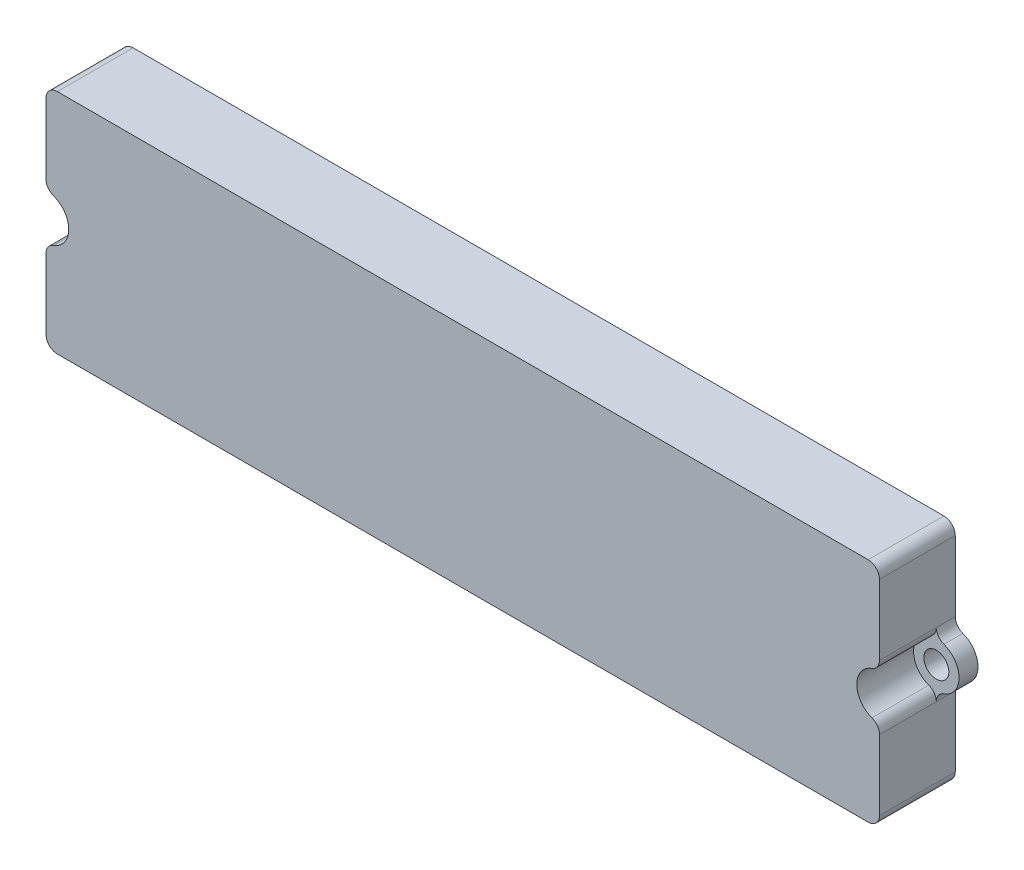
ISO-10303-21;
HEADER;
FILE_DESCRIPTION(('STEP AP214'),'2;1');
FILE_NAME('part.step','',(''),(''),'','','');
FILE_SCHEMA(('AUTOMOTIVE_DESIGN { 1 0 10303 214 1 1 1 1 }'));
ENDSEC;
DATA;
#1=APPLICATION_CONTEXT('core data for automotive mechanical design processes');
#2=APPLICATION_PROTOCOL_DEFINITION('international standard','automotive_design',2000,#1);
#3=PRODUCT_CONTEXT('',#1,'mechanical');
#4=PRODUCT('Part','Part','',(#3));
#5=PRODUCT_RELATED_PRODUCT_CATEGORY('part','',(#4));
#6=PRODUCT_DEFINITION_FORMATION('','',#4);
#7=PRODUCT_DEFINITION_CONTEXT('part definition',#1,'design');
#8=PRODUCT_DEFINITION('design','',#6,#7);
#9=PRODUCT_DEFINITION_SHAPE('','',#8);
#10=(LENGTH_UNIT() NAMED_UNIT(*) SI_UNIT(.MILLI.,.METRE.));
#11=(NAMED_UNIT(*) PLANE_ANGLE_UNIT() SI_UNIT($,.RADIAN.));
#12=(NAMED_UNIT(*) SI_UNIT($,.STERADIAN.) SOLID_ANGLE_UNIT());
#13=UNCERTAINTY_MEASURE_WITH_UNIT(LENGTH_MEASURE(1.E-05),#10,'distance_accuracy_value','');
#14=(GEOMETRIC_REPRESENTATION_CONTEXT(3) GLOBAL_UNCERTAINTY_ASSIGNED_CONTEXT((#13)) GLOBAL_UNIT_ASSIGNED_CONTEXT((#10,
#11,#12)) REPRESENTATION_CONTEXT('',''));
#15=CARTESIAN_POINT('',(0.,0.,0.));
#16=DIRECTION('',(0.,0.,1.));
#17=DIRECTION('',(1.,0.,0.));
#18=AXIS2_PLACEMENT_3D('',#15,#16,#17);
#19=CARTESIAN_POINT('',(110.,0.,-16.9705627484772));
#20=DIRECTION('',(0.,0.,1.));
#21=DIRECTION('',(1.,0.,0.));
#22=AXIS2_PLACEMENT_3D('',#19,#20,#21);
#23=CYLINDRICAL_SURFACE('',#22,6.);
#24=CARTESIAN_POINT('',(110.,0.,5.));
#25=DIRECTION('',(0.,0.,1.));
#26=DIRECTION('',(1.,0.,0.));
#27=AXIS2_PLACEMENT_3D('',#24,#25,#26);
#28=CIRCLE('',#27,6.);
#29=CARTESIAN_POINT('',(112.,-5.65685424949238,5.));
#30=VERTEX_POINT('',#29);
#31=CARTESIAN_POINT('',(112.,5.65685424949238,5.));
#32=VERTEX_POINT('',#31);
#33=EDGE_CURVE('E352',#30,#32,#28,.T.);
#34=ORIENTED_EDGE('',*,*,#33,.F.);
#35=DIRECTION('',(0.,0.,1.));
#36=VECTOR('',#35,1.);
#37=CARTESIAN_POINT('',(112.,-5.65685424949239,-16.9705627484772));
#38=LINE('',#37,#36);
#39=CARTESIAN_POINT('',(112.,-5.65685424949238,0.));
#40=VERTEX_POINT('',#39);
#41=EDGE_CURVE('E300',#30,#40,#38,.F.);
#42=ORIENTED_EDGE('',*,*,#41,.T.);
#43=CARTESIAN_POINT('',(110.,0.,0.));
#44=DIRECTION('',(0.,0.,-1.));
#45=DIRECTION('',(-1.,0.,0.));
#46=AXIS2_PLACEMENT_3D('',#43,#44,#45);
#47=CIRCLE('',#46,6.);
#48=CARTESIAN_POINT('',(112.,5.65685424949238,0.));
#49=VERTEX_POINT('',#48);
#50=EDGE_CURVE('E365',#40,#49,#47,.F.);
#51=ORIENTED_EDGE('',*,*,#50,.T.);
#52=DIRECTION('',(0.,0.,1.));
#53=VECTOR('',#52,1.);
#54=CARTESIAN_POINT('',(112.,5.65685424949238,-16.9705627484772));
#55=LINE('',#54,#53);
#56=EDGE_CURVE('E298',#49,#32,#55,.T.);
#57=ORIENTED_EDGE('',*,*,#56,.T.);
#58=EDGE_LOOP('',(#34,#42,#51,#57));
#59=FACE_BOUND('',#58,.T.);
#60=ADVANCED_FACE('F32',(#59),#23,.T.);
#61=CARTESIAN_POINT('',(110.,0.,0.));
#62=DIRECTION('',(0.,0.,1.));
#63=DIRECTION('',(1.,0.,0.));
#64=AXIS2_PLACEMENT_3D('',#61,#62,#63);
#65=CYLINDRICAL_SURFACE('',#64,3.29999999999999);
#66=CARTESIAN_POINT('',(110.,0.,0.));
#67=DIRECTION('',(0.,0.,1.));
#68=DIRECTION('',(1.,0.,0.));
#69=AXIS2_PLACEMENT_3D('',#66,#67,#68);
#70=CIRCLE('',#69,3.29999999999999);
#71=CARTESIAN_POINT('',(113.3,0.,0.));
#72=VERTEX_POINT('',#71);
#73=EDGE_CURVE('E250',#72,#72,#70,.T.);
#74=ORIENTED_EDGE('',*,*,#73,.F.);
#75=EDGE_LOOP('',(#74));
#76=FACE_BOUND('',#75,.T.);
#77=CARTESIAN_POINT('',(110.,0.,5.));
#78=DIRECTION('',(0.,0.,1.));
#79=DIRECTION('',(1.,0.,0.));
#80=AXIS2_PLACEMENT_3D('',#77,#78,#79);
#81=CIRCLE('',#80,3.29999999999999);
#82=CARTESIAN_POINT('',(113.3,0.,5.));
#83=VERTEX_POINT('',#82);
#84=EDGE_CURVE('E252',#83,#83,#81,.F.);
#85=ORIENTED_EDGE('',*,*,#84,.F.);
#86=EDGE_LOOP('',(#85));
#87=FACE_BOUND('',#86,.T.);
#88=ADVANCED_FACE('F433',(#76,#87),#65,.F.);
#89=CARTESIAN_POINT('',(-110.,0.,-16.9705627484772));
#90=DIRECTION('',(0.,0.,1.));
#91=DIRECTION('',(1.,0.,0.));
#92=AXIS2_PLACEMENT_3D('',#89,#90,#91);
#93=CYLINDRICAL_SURFACE('',#92,6.);
#94=CARTESIAN_POINT('',(-110.,0.,0.));
#95=DIRECTION('',(0.,0.,-1.));
#96=DIRECTION('',(-1.,0.,0.));
#97=AXIS2_PLACEMENT_3D('',#94,#95,#96);
#98=CIRCLE('',#97,6.);
#99=CARTESIAN_POINT('',(-112.,5.65685424949238,0.));
#100=VERTEX_POINT('',#99);
#101=CARTESIAN_POINT('',(-112.,-5.65685424949238,0.));
#102=VERTEX_POINT('',#101);
#103=EDGE_CURVE('E368',#100,#102,#98,.F.);
#104=ORIENTED_EDGE('',*,*,#103,.T.);
#105=DIRECTION('',(0.,0.,1.));
#106=VECTOR('',#105,1.);
#107=CARTESIAN_POINT('',(-112.,-5.65685424949238,-16.9705627484772));
#108=LINE('',#107,#106);
#109=CARTESIAN_POINT('',(-112.,-5.65685424949238,5.));
#110=VERTEX_POINT('',#109);
#111=EDGE_CURVE('E261',#102,#110,#108,.T.);
#112=ORIENTED_EDGE('',*,*,#111,.T.);
#113=CARTESIAN_POINT('',(-110.,0.,5.));
#114=DIRECTION('',(0.,0.,1.));
#115=DIRECTION('',(1.,0.,0.));
#116=AXIS2_PLACEMENT_3D('',#113,#114,#115);
#117=CIRCLE('',#116,6.);
#118=CARTESIAN_POINT('',(-112.,5.65685424949238,5.));
#119=VERTEX_POINT('',#118);
#120=EDGE_CURVE('E251',#119,#110,#117,.T.);
#121=ORIENTED_EDGE('',*,*,#120,.F.);
#122=DIRECTION('',(0.,0.,1.));
#123=VECTOR('',#122,1.);
#124=CARTESIAN_POINT('',(-112.,5.65685424949238,-16.9705627484772));
#125=LINE('',#124,#123);
#126=EDGE_CURVE('E259',#119,#100,#125,.F.);
#127=ORIENTED_EDGE('',*,*,#126,.T.);
#128=EDGE_LOOP('',(#104,#112,#121,#127));
#129=FACE_BOUND('',#128,.T.);
#130=ADVANCED_FACE('F394',(#129),#93,.T.);
#131=CARTESIAN_POINT('',(-110.,0.,0.));
#132=DIRECTION('',(0.,0.,1.));
#133=DIRECTION('',(1.,0.,0.));
#134=AXIS2_PLACEMENT_3D('',#131,#132,#133);
#135=CYLINDRICAL_SURFACE('',#134,3.3);
#136=CARTESIAN_POINT('',(-110.,0.,0.));
#137=DIRECTION('',(0.,0.,1.));
#138=DIRECTION('',(1.,0.,0.));
#139=AXIS2_PLACEMENT_3D('',#136,#137,#138);
#140=CIRCLE('',#139,3.3);
#141=CARTESIAN_POINT('',(-106.7,0.,0.));
#142=VERTEX_POINT('',#141);
#143=EDGE_CURVE('E362',#142,#142,#140,.T.);
#144=ORIENTED_EDGE('',*,*,#143,.F.);
#145=EDGE_LOOP('',(#144));
#146=FACE_BOUND('',#145,.T.);
#147=CARTESIAN_POINT('',(-110.,0.,5.));
#148=DIRECTION('',(0.,0.,1.));
#149=DIRECTION('',(1.,0.,0.));
#150=AXIS2_PLACEMENT_3D('',#147,#148,#149);
#151=CIRCLE('',#150,3.3);
#152=CARTESIAN_POINT('',(-106.7,0.,5.));
#153=VERTEX_POINT('',#152);
#154=EDGE_CURVE('E247',#153,#153,#151,.F.);
#155=ORIENTED_EDGE('',*,*,#154,.F.);
#156=EDGE_LOOP('',(#155));
#157=FACE_BOUND('',#156,.T.);
#158=ADVANCED_FACE('F442',(#146,#157),#135,.F.);
#159=CARTESIAN_POINT('',(110.,-30.,20.));
#160=DIRECTION('',(-1.,0.,0.));
#161=DIRECTION('',(0.,0.,1.));
#162=AXIS2_PLACEMENT_3D('',#159,#160,#161);
#163=PLANE('',#162);
#164=DIRECTION('',(0.,0.,1.));
#165=VECTOR('',#164,1.);
#166=CARTESIAN_POINT('',(110.,-8.48528137423857,20.));
#167=LINE('',#166,#165);
#168=CARTESIAN_POINT('',(110.,-8.48528137423857,0.));
#169=VERTEX_POINT('',#168);
#170=CARTESIAN_POINT('',(110.,-8.48528137423857,5.));
#171=VERTEX_POINT('',#170);
#172=EDGE_CURVE('E295',#169,#171,#167,.T.);
#173=ORIENTED_EDGE('',*,*,#172,.T.);
#174=DIRECTION('',(0.,0.,1.));
#175=VECTOR('',#174,1.);
#176=CARTESIAN_POINT('',(110.,-8.48528137423857,20.));
#177=LINE('',#176,#175);
#178=CARTESIAN_POINT('',(110.,-8.48528137423857,20.));
#179=VERTEX_POINT('',#178);
#180=EDGE_CURVE('E313',#171,#179,#177,.T.);
#181=ORIENTED_EDGE('',*,*,#180,.T.);
#182=DIRECTION('',(0.,1.,0.));
#183=VECTOR('',#182,1.);
#184=CARTESIAN_POINT('',(110.,-30.,20.));
#185=LINE('',#184,#183);
#186=CARTESIAN_POINT('',(110.,-27.,20.));
#187=VERTEX_POINT('',#186);
#188=EDGE_CURVE('E211',#187,#179,#185,.T.);
#189=ORIENTED_EDGE('',*,*,#188,.F.);
#190=DIRECTION('',(0.,0.,-1.));
#191=VECTOR('',#190,1.);
#192=CARTESIAN_POINT('',(110.,-27.,20.));
#193=LINE('',#192,#191);
#194=CARTESIAN_POINT('',(110.,-27.,0.));
#195=VERTEX_POINT('',#194);
#196=EDGE_CURVE('E238',#187,#195,#193,.T.);
#197=ORIENTED_EDGE('',*,*,#196,.T.);
#198=DIRECTION('',(0.,1.,0.));
#199=VECTOR('',#198,1.);
#200=CARTESIAN_POINT('',(110.,-30.,0.));
#201=LINE('',#200,#199);
#202=EDGE_CURVE('E343',#195,#169,#201,.T.);
#203=ORIENTED_EDGE('',*,*,#202,.T.);
#204=EDGE_LOOP('',(#173,#181,#189,#197,#203));
#205=FACE_BOUND('',#204,.T.);
#206=ADVANCED_FACE('F340',(#205),#163,.F.);
#207=CARTESIAN_POINT('',(-110.,-30.,20.));
#208=DIRECTION('',(1.,0.,0.));
#209=DIRECTION('',(0.,1.,0.));
#210=AXIS2_PLACEMENT_3D('',#207,#208,#209);
#211=PLANE('',#210);
#212=DIRECTION('',(0.,0.,1.));
#213=VECTOR('',#212,1.);
#214=CARTESIAN_POINT('',(-110.,8.48528137423857,20.));
#215=LINE('',#214,#213);
#216=CARTESIAN_POINT('',(-110.,8.48528137423857,0.));
#217=VERTEX_POINT('',#216);
#218=CARTESIAN_POINT('',(-110.,8.48528137423857,5.));
#219=VERTEX_POINT('',#218);
#220=EDGE_CURVE('E263',#217,#219,#215,.T.);
#221=ORIENTED_EDGE('',*,*,#220,.T.);
#222=DIRECTION('',(0.,0.,1.));
#223=VECTOR('',#222,1.);
#224=CARTESIAN_POINT('',(-110.,8.48528137423857,20.));
#225=LINE('',#224,#223);
#226=CARTESIAN_POINT('',(-110.,8.48528137423857,20.));
#227=VERTEX_POINT('',#226);
#228=EDGE_CURVE('E275',#219,#227,#225,.T.);
#229=ORIENTED_EDGE('',*,*,#228,.T.);
#230=DIRECTION('',(0.,-1.,0.));
#231=VECTOR('',#230,1.);
#232=CARTESIAN_POINT('',(-110.,-30.,20.));
#233=LINE('',#232,#231);
#234=CARTESIAN_POINT('',(-110.,27.,20.));
#235=VERTEX_POINT('',#234);
#236=EDGE_CURVE('E376',#235,#227,#233,.T.);
#237=ORIENTED_EDGE('',*,*,#236,.F.);
#238=DIRECTION('',(0.,0.,-1.));
#239=VECTOR('',#238,1.);
#240=CARTESIAN_POINT('',(-110.,27.,20.));
#241=LINE('',#240,#239);
#242=CARTESIAN_POINT('',(-110.,27.,0.));
#243=VERTEX_POINT('',#242);
#244=EDGE_CURVE('E191',#235,#243,#241,.T.);
#245=ORIENTED_EDGE('',*,*,#244,.T.);
#246=DIRECTION('',(0.,-1.,0.));
#247=VECTOR('',#246,1.);
#248=CARTESIAN_POINT('',(-110.,-30.,0.));
#249=LINE('',#248,#247);
#250=EDGE_CURVE('E209',#243,#217,#249,.T.);
#251=ORIENTED_EDGE('',*,*,#250,.T.);
#252=EDGE_LOOP('',(#221,#229,#237,#245,#251));
#253=FACE_BOUND('',#252,.T.);
#254=ADVANCED_FACE('F409',(#253),#211,.F.);
#255=CARTESIAN_POINT('',(110.,8.48528137423857,20.));
#256=VERTEX_POINT('',#255);
#257=CARTESIAN_POINT('',(110.,27.,20.));
#258=VERTEX_POINT('',#257);
#259=EDGE_CURVE('E208',#256,#258,#185,.T.);
#260=ORIENTED_EDGE('',*,*,#259,.F.);
#261=DIRECTION('',(0.,0.,1.));
#262=VECTOR('',#261,1.);
#263=CARTESIAN_POINT('',(110.,8.48528137423857,20.));
#264=LINE('',#263,#262);
#265=CARTESIAN_POINT('',(110.,8.48528137423857,5.));
#266=VERTEX_POINT('',#265);
#267=EDGE_CURVE('E323',#256,#266,#264,.F.);
#268=ORIENTED_EDGE('',*,*,#267,.T.);
#269=DIRECTION('',(0.,0.,1.));
#270=VECTOR('',#269,1.);
#271=CARTESIAN_POINT('',(110.,8.48528137423857,20.));
#272=LINE('',#271,#270);
#273=CARTESIAN_POINT('',(110.,8.48528137423857,0.));
#274=VERTEX_POINT('',#273);
#275=EDGE_CURVE('E302',#266,#274,#272,.F.);
#276=ORIENTED_EDGE('',*,*,#275,.T.);
#277=CARTESIAN_POINT('',(110.,27.,0.));
#278=VERTEX_POINT('',#277);
#279=EDGE_CURVE('E370',#274,#278,#201,.T.);
#280=ORIENTED_EDGE('',*,*,#279,.T.);
#281=DIRECTION('',(0.,0.,-1.));
#282=VECTOR('',#281,1.);
#283=CARTESIAN_POINT('',(110.,27.,20.));
#284=LINE('',#283,#282);
#285=EDGE_CURVE('E235',#278,#258,#284,.F.);
#286=ORIENTED_EDGE('',*,*,#285,.T.);
#287=EDGE_LOOP('',(#260,#268,#276,#280,#286));
#288=FACE_BOUND('',#287,.T.);
#289=ADVANCED_FACE('F423',(#288),#163,.F.);
#290=CARTESIAN_POINT('',(-110.,30.,20.));
#291=DIRECTION('',(0.,-1.,0.));
#292=DIRECTION('',(0.,0.,-1.));
#293=AXIS2_PLACEMENT_3D('',#290,#291,#292);
#294=PLANE('',#293);
#295=DIRECTION('',(-1.,0.,0.));
#296=VECTOR('',#295,1.);
#297=CARTESIAN_POINT('',(-110.,30.,20.));
#298=LINE('',#297,#296);
#299=CARTESIAN_POINT('',(107.,30.,20.));
#300=VERTEX_POINT('',#299);
#301=CARTESIAN_POINT('',(-107.,30.,20.));
#302=VERTEX_POINT('',#301);
#303=EDGE_CURVE('E372',#300,#302,#298,.T.);
#304=ORIENTED_EDGE('',*,*,#303,.F.);
#305=DIRECTION('',(0.,0.,-1.));
#306=VECTOR('',#305,1.);
#307=CARTESIAN_POINT('',(107.,30.,20.));
#308=LINE('',#307,#306);
#309=CARTESIAN_POINT('',(107.,30.,0.));
#310=VERTEX_POINT('',#309);
#311=EDGE_CURVE('E243',#300,#310,#308,.T.);
#312=ORIENTED_EDGE('',*,*,#311,.T.);
#313=DIRECTION('',(-1.,0.,0.));
#314=VECTOR('',#313,1.);
#315=CARTESIAN_POINT('',(-110.,30.,0.));
#316=LINE('',#315,#314);
#317=CARTESIAN_POINT('',(-107.,30.,0.));
#318=VERTEX_POINT('',#317);
#319=EDGE_CURVE('E380',#310,#318,#316,.T.);
#320=ORIENTED_EDGE('',*,*,#319,.T.);
#321=DIRECTION('',(0.,0.,-1.));
#322=VECTOR('',#321,1.);
#323=CARTESIAN_POINT('',(-107.,30.,20.));
#324=LINE('',#323,#322);
#325=EDGE_CURVE('E241',#318,#302,#324,.F.);
#326=ORIENTED_EDGE('',*,*,#325,.T.);
#327=EDGE_LOOP('',(#304,#312,#320,#326));
#328=FACE_BOUND('',#327,.T.);
#329=ADVANCED_FACE('F454',(#328),#294,.F.);
#330=CARTESIAN_POINT('',(-110.,-8.48528137423857,20.));
#331=VERTEX_POINT('',#330);
#332=CARTESIAN_POINT('',(-110.,-27.,20.));
#333=VERTEX_POINT('',#332);
#334=EDGE_CURVE('E375',#331,#333,#233,.T.);
#335=ORIENTED_EDGE('',*,*,#334,.F.);
#336=DIRECTION('',(0.,0.,1.));
#337=VECTOR('',#336,1.);
#338=CARTESIAN_POINT('',(-110.,-8.48528137423857,20.));
#339=LINE('',#338,#337);
#340=CARTESIAN_POINT('',(-110.,-8.48528137423857,5.));
#341=VERTEX_POINT('',#340);
#342=EDGE_CURVE('E286',#331,#341,#339,.F.);
#343=ORIENTED_EDGE('',*,*,#342,.T.);
#344=DIRECTION('',(0.,0.,1.));
#345=VECTOR('',#344,1.);
#346=CARTESIAN_POINT('',(-110.,-8.48528137423857,20.));
#347=LINE('',#346,#345);
#348=CARTESIAN_POINT('',(-110.,-8.48528137423857,0.));
#349=VERTEX_POINT('',#348);
#350=EDGE_CURVE('E246',#341,#349,#347,.F.);
#351=ORIENTED_EDGE('',*,*,#350,.T.);
#352=CARTESIAN_POINT('',(-110.,-27.,0.));
#353=VERTEX_POINT('',#352);
#354=EDGE_CURVE('E214',#349,#353,#249,.T.);
#355=ORIENTED_EDGE('',*,*,#354,.T.);
#356=DIRECTION('',(0.,0.,-1.));
#357=VECTOR('',#356,1.);
#358=CARTESIAN_POINT('',(-110.,-27.,20.));
#359=LINE('',#358,#357);
#360=EDGE_CURVE('E187',#353,#333,#359,.F.);
#361=ORIENTED_EDGE('',*,*,#360,.T.);
#362=EDGE_LOOP('',(#335,#343,#351,#355,#361));
#363=FACE_BOUND('',#362,.T.);
#364=ADVANCED_FACE('F387',(#363),#211,.F.);
#365=CARTESIAN_POINT('',(-110.,-30.,20.));
#366=DIRECTION('',(0.,1.,0.));
#367=DIRECTION('',(0.,0.,1.));
#368=AXIS2_PLACEMENT_3D('',#365,#366,#367);
#369=PLANE('',#368);
#370=DIRECTION('',(1.,0.,0.));
#371=VECTOR('',#370,1.);
#372=CARTESIAN_POINT('',(-110.,-30.,20.));
#373=LINE('',#372,#371);
#374=CARTESIAN_POINT('',(-107.,-30.,20.));
#375=VERTEX_POINT('',#374);
#376=CARTESIAN_POINT('',(107.,-30.,20.));
#377=VERTEX_POINT('',#376);
#378=EDGE_CURVE('E201',#375,#377,#373,.T.);
#379=ORIENTED_EDGE('',*,*,#378,.F.);
#380=DIRECTION('',(0.,0.,-1.));
#381=VECTOR('',#380,1.);
#382=CARTESIAN_POINT('',(-107.,-30.,20.));
#383=LINE('',#382,#381);
#384=CARTESIAN_POINT('',(-107.,-30.,0.));
#385=VERTEX_POINT('',#384);
#386=EDGE_CURVE('E185',#375,#385,#383,.T.);
#387=ORIENTED_EDGE('',*,*,#386,.T.);
#388=DIRECTION('',(1.,0.,0.));
#389=VECTOR('',#388,1.);
#390=CARTESIAN_POINT('',(-110.,-30.,0.));
#391=LINE('',#390,#389);
#392=CARTESIAN_POINT('',(107.,-30.,0.));
#393=VERTEX_POINT('',#392);
#394=EDGE_CURVE('E198',#385,#393,#391,.T.);
#395=ORIENTED_EDGE('',*,*,#394,.T.);
#396=DIRECTION('',(0.,0.,-1.));
#397=VECTOR('',#396,1.);
#398=CARTESIAN_POINT('',(107.,-30.,20.));
#399=LINE('',#398,#397);
#400=EDGE_CURVE('E203',#393,#377,#399,.F.);
#401=ORIENTED_EDGE('',*,*,#400,.T.);
#402=EDGE_LOOP('',(#379,#387,#395,#401));
#403=FACE_BOUND('',#402,.T.);
#404=ADVANCED_FACE('F197',(#403),#369,.F.);
#405=CARTESIAN_POINT('',(0.,0.,20.));
#406=DIRECTION('',(0.,0.,-1.));
#407=DIRECTION('',(-1.,0.,0.));
#408=AXIS2_PLACEMENT_3D('',#405,#406,#407);
#409=PLANE('',#408);
#410=ORIENTED_EDGE('',*,*,#188,.T.);
#411=CARTESIAN_POINT('',(107.,-8.48528137423857,20.));
#412=DIRECTION('',(0.,0.,-1.));
#413=DIRECTION('',(-1.,0.,0.));
#414=AXIS2_PLACEMENT_3D('',#411,#412,#413);
#415=CIRCLE('',#414,3.);
#416=CARTESIAN_POINT('',(108.,-5.65685424949238,20.));
#417=VERTEX_POINT('',#416);
#418=EDGE_CURVE('E318',#179,#417,#415,.F.);
#419=ORIENTED_EDGE('',*,*,#418,.T.);
#420=CARTESIAN_POINT('',(110.,0.,20.));
#421=DIRECTION('',(0.,0.,1.));
#422=DIRECTION('',(1.,0.,0.));
#423=AXIS2_PLACEMENT_3D('',#420,#421,#422);
#424=CIRCLE('',#423,6.);
#425=CARTESIAN_POINT('',(108.,5.65685424949238,20.));
#426=VERTEX_POINT('',#425);
#427=EDGE_CURVE('E348',#426,#417,#424,.T.);
#428=ORIENTED_EDGE('',*,*,#427,.F.);
#429=CARTESIAN_POINT('',(107.,8.48528137423857,20.));
#430=DIRECTION('',(0.,0.,-1.));
#431=DIRECTION('',(-1.,0.,0.));
#432=AXIS2_PLACEMENT_3D('',#429,#430,#431);
#433=CIRCLE('',#432,3.);
#434=EDGE_CURVE('E316',#426,#256,#433,.F.);
#435=ORIENTED_EDGE('',*,*,#434,.T.);
#436=ORIENTED_EDGE('',*,*,#259,.T.);
#437=CARTESIAN_POINT('',(107.,27.,20.));
#438=DIRECTION('',(0.,0.,-1.));
#439=DIRECTION('',(-1.,0.,0.));
#440=AXIS2_PLACEMENT_3D('',#437,#438,#439);
#441=CIRCLE('',#440,3.);
#442=EDGE_CURVE('E229',#258,#300,#441,.F.);
#443=ORIENTED_EDGE('',*,*,#442,.T.);
#444=ORIENTED_EDGE('',*,*,#303,.T.);
#445=CARTESIAN_POINT('',(-107.,27.,20.));
#446=DIRECTION('',(0.,0.,-1.));
#447=DIRECTION('',(-1.,0.,0.));
#448=AXIS2_PLACEMENT_3D('',#445,#446,#447);
#449=CIRCLE('',#448,3.);
#450=EDGE_CURVE('E227',#302,#235,#449,.F.);
#451=ORIENTED_EDGE('',*,*,#450,.T.);
#452=ORIENTED_EDGE('',*,*,#236,.T.);
#453=CARTESIAN_POINT('',(-107.,8.48528137423857,20.));
#454=DIRECTION('',(0.,0.,-1.));
#455=DIRECTION('',(-1.,0.,0.));
#456=AXIS2_PLACEMENT_3D('',#453,#454,#455);
#457=CIRCLE('',#456,3.);
#458=CARTESIAN_POINT('',(-108.,5.65685424949238,20.));
#459=VERTEX_POINT('',#458);
#460=EDGE_CURVE('E278',#227,#459,#457,.F.);
#461=ORIENTED_EDGE('',*,*,#460,.T.);
#462=CARTESIAN_POINT('',(-110.,0.,20.));
#463=DIRECTION('',(0.,0.,1.));
#464=DIRECTION('',(1.,0.,0.));
#465=AXIS2_PLACEMENT_3D('',#462,#463,#464);
#466=CIRCLE('',#465,6.);
#467=CARTESIAN_POINT('',(-108.,-5.65685424949238,20.));
#468=VERTEX_POINT('',#467);
#469=EDGE_CURVE('E255',#468,#459,#466,.T.);
#470=ORIENTED_EDGE('',*,*,#469,.F.);
#471=CARTESIAN_POINT('',(-107.,-8.48528137423857,20.));
#472=DIRECTION('',(0.,0.,-1.));
#473=DIRECTION('',(-1.,0.,0.));
#474=AXIS2_PLACEMENT_3D('',#471,#472,#473);
#475=CIRCLE('',#474,3.);
#476=EDGE_CURVE('E291',#468,#331,#475,.F.);
#477=ORIENTED_EDGE('',*,*,#476,.T.);
#478=ORIENTED_EDGE('',*,*,#334,.T.);
#479=CARTESIAN_POINT('',(-107.,-27.,20.));
#480=DIRECTION('',(0.,0.,-1.));
#481=DIRECTION('',(-1.,0.,0.));
#482=AXIS2_PLACEMENT_3D('',#479,#480,#481);
#483=CIRCLE('',#482,3.);
#484=EDGE_CURVE('E233',#333,#375,#483,.F.);
#485=ORIENTED_EDGE('',*,*,#484,.T.);
#486=ORIENTED_EDGE('',*,*,#378,.T.);
#487=CARTESIAN_POINT('',(107.,-27.,20.));
#488=DIRECTION('',(0.,0.,-1.));
#489=DIRECTION('',(-1.,0.,0.));
#490=AXIS2_PLACEMENT_3D('',#487,#488,#489);
#491=CIRCLE('',#490,3.);
#492=EDGE_CURVE('E231',#377,#187,#491,.F.);
#493=ORIENTED_EDGE('',*,*,#492,.T.);
#494=EDGE_LOOP('',(#410,#419,#428,#435,#436,#443,#444,#451,#452,#461,#470,#477,#478,#485,#486,#493));
#495=FACE_BOUND('',#494,.T.);
#496=ADVANCED_FACE('F347',(#495),#409,.F.);
#497=CARTESIAN_POINT('',(0.,0.,0.));
#498=DIRECTION('',(0.,0.,-1.));
#499=DIRECTION('',(-1.,0.,0.));
#500=AXIS2_PLACEMENT_3D('',#497,#498,#499);
#501=PLANE('',#500);
#502=ORIENTED_EDGE('',*,*,#73,.T.);
#503=EDGE_LOOP('',(#502));
#504=FACE_BOUND('',#503,.T.);
#505=ORIENTED_EDGE('',*,*,#143,.T.);
#506=EDGE_LOOP('',(#505));
#507=FACE_BOUND('',#506,.T.);
#508=ORIENTED_EDGE('',*,*,#279,.F.);
#509=CARTESIAN_POINT('',(113.,8.48528137423857,0.));
#510=DIRECTION('',(0.,0.,-1.));
#511=DIRECTION('',(-1.,0.,0.));
#512=AXIS2_PLACEMENT_3D('',#509,#510,#511);
#513=CIRCLE('',#512,3.);
#514=EDGE_CURVE('E309',#274,#49,#513,.F.);
#515=ORIENTED_EDGE('',*,*,#514,.T.);
#516=ORIENTED_EDGE('',*,*,#50,.F.);
#517=CARTESIAN_POINT('',(113.,-8.48528137423857,0.));
#518=DIRECTION('',(0.,0.,-1.));
#519=DIRECTION('',(-1.,0.,0.));
#520=AXIS2_PLACEMENT_3D('',#517,#518,#519);
#521=CIRCLE('',#520,3.);
#522=EDGE_CURVE('E307',#40,#169,#521,.F.);
#523=ORIENTED_EDGE('',*,*,#522,.T.);
#524=ORIENTED_EDGE('',*,*,#202,.F.);
#525=CARTESIAN_POINT('',(107.,-27.,0.));
#526=DIRECTION('',(0.,0.,-1.));
#527=DIRECTION('',(-1.,0.,0.));
#528=AXIS2_PLACEMENT_3D('',#525,#526,#527);
#529=CIRCLE('',#528,3.);
#530=EDGE_CURVE('E192',#195,#393,#529,.T.);
#531=ORIENTED_EDGE('',*,*,#530,.T.);
#532=ORIENTED_EDGE('',*,*,#394,.F.);
#533=CARTESIAN_POINT('',(-107.,-27.,0.));
#534=DIRECTION('',(0.,0.,-1.));
#535=DIRECTION('',(-1.,0.,0.));
#536=AXIS2_PLACEMENT_3D('',#533,#534,#535);
#537=CIRCLE('',#536,3.);
#538=EDGE_CURVE('E181',#385,#353,#537,.T.);
#539=ORIENTED_EDGE('',*,*,#538,.T.);
#540=ORIENTED_EDGE('',*,*,#354,.F.);
#541=CARTESIAN_POINT('',(-113.,-8.48528137423857,0.));
#542=DIRECTION('',(0.,0.,-1.));
#543=DIRECTION('',(-1.,0.,0.));
#544=AXIS2_PLACEMENT_3D('',#541,#542,#543);
#545=CIRCLE('',#544,3.);
#546=EDGE_CURVE('E266',#349,#102,#545,.F.);
#547=ORIENTED_EDGE('',*,*,#546,.T.);
#548=ORIENTED_EDGE('',*,*,#103,.F.);
#549=CARTESIAN_POINT('',(-113.,8.48528137423857,0.));
#550=DIRECTION('',(0.,0.,-1.));
#551=DIRECTION('',(-1.,0.,0.));
#552=AXIS2_PLACEMENT_3D('',#549,#550,#551);
#553=CIRCLE('',#552,3.);
#554=EDGE_CURVE('E273',#100,#217,#553,.F.);
#555=ORIENTED_EDGE('',*,*,#554,.T.);
#556=ORIENTED_EDGE('',*,*,#250,.F.);
#557=CARTESIAN_POINT('',(-107.,27.,0.));
#558=DIRECTION('',(0.,0.,-1.));
#559=DIRECTION('',(-1.,0.,0.));
#560=AXIS2_PLACEMENT_3D('',#557,#558,#559);
#561=CIRCLE('',#560,3.);
#562=EDGE_CURVE('E202',#243,#318,#561,.T.);
#563=ORIENTED_EDGE('',*,*,#562,.T.);
#564=ORIENTED_EDGE('',*,*,#319,.F.);
#565=CARTESIAN_POINT('',(107.,27.,0.));
#566=DIRECTION('',(0.,0.,-1.));
#567=DIRECTION('',(-1.,0.,0.));
#568=AXIS2_PLACEMENT_3D('',#565,#566,#567);
#569=CIRCLE('',#568,3.);
#570=EDGE_CURVE('E220',#310,#278,#569,.T.);
#571=ORIENTED_EDGE('',*,*,#570,.T.);
#572=EDGE_LOOP('',(#508,#515,#516,#523,#524,#531,#532,#539,#540,#547,#548,#555,#556,#563,#564,#571));
#573=FACE_BOUND('',#572,.T.);
#574=ADVANCED_FACE('F206',(#504,#507,#573),#501,.T.);
#575=CARTESIAN_POINT('',(-107.,-27.,20.));
#576=DIRECTION('',(0.,0.,-1.));
#577=DIRECTION('',(-1.,0.,0.));
#578=AXIS2_PLACEMENT_3D('',#575,#576,#577);
#579=CYLINDRICAL_SURFACE('',#578,3.);
#580=ORIENTED_EDGE('',*,*,#484,.F.);
#581=ORIENTED_EDGE('',*,*,#360,.F.);
#582=ORIENTED_EDGE('',*,*,#538,.F.);
#583=ORIENTED_EDGE('',*,*,#386,.F.);
#584=EDGE_LOOP('',(#580,#581,#582,#583));
#585=FACE_BOUND('',#584,.T.);
#586=ADVANCED_FACE('F184',(#585),#579,.T.);
#587=CARTESIAN_POINT('',(107.,-27.,20.));
#588=DIRECTION('',(0.,0.,-1.));
#589=DIRECTION('',(-1.,0.,0.));
#590=AXIS2_PLACEMENT_3D('',#587,#588,#589);
#591=CYLINDRICAL_SURFACE('',#590,3.);
#592=ORIENTED_EDGE('',*,*,#492,.F.);
#593=ORIENTED_EDGE('',*,*,#400,.F.);
#594=ORIENTED_EDGE('',*,*,#530,.F.);
#595=ORIENTED_EDGE('',*,*,#196,.F.);
#596=EDGE_LOOP('',(#592,#593,#594,#595));
#597=FACE_BOUND('',#596,.T.);
#598=ADVANCED_FACE('F461',(#597),#591,.T.);
#599=CARTESIAN_POINT('',(107.,27.,20.));
#600=DIRECTION('',(0.,0.,-1.));
#601=DIRECTION('',(-1.,0.,0.));
#602=AXIS2_PLACEMENT_3D('',#599,#600,#601);
#603=CYLINDRICAL_SURFACE('',#602,3.);
#604=ORIENTED_EDGE('',*,*,#442,.F.);
#605=ORIENTED_EDGE('',*,*,#285,.F.);
#606=ORIENTED_EDGE('',*,*,#570,.F.);
#607=ORIENTED_EDGE('',*,*,#311,.F.);
#608=EDGE_LOOP('',(#604,#605,#606,#607));
#609=FACE_BOUND('',#608,.T.);
#610=ADVANCED_FACE('F420',(#609),#603,.T.);
#611=CARTESIAN_POINT('',(-107.,27.,20.));
#612=DIRECTION('',(0.,0.,-1.));
#613=DIRECTION('',(-1.,0.,0.));
#614=AXIS2_PLACEMENT_3D('',#611,#612,#613);
#615=CYLINDRICAL_SURFACE('',#614,3.);
#616=ORIENTED_EDGE('',*,*,#450,.F.);
#617=ORIENTED_EDGE('',*,*,#325,.F.);
#618=ORIENTED_EDGE('',*,*,#562,.F.);
#619=ORIENTED_EDGE('',*,*,#244,.F.);
#620=EDGE_LOOP('',(#616,#617,#618,#619));
#621=FACE_BOUND('',#620,.T.);
#622=ADVANCED_FACE('F415',(#621),#615,.T.);
#623=CARTESIAN_POINT('',(-110.,0.,5.));
#624=DIRECTION('',(0.,0.,1.));
#625=DIRECTION('',(1.,0.,0.));
#626=AXIS2_PLACEMENT_3D('',#623,#624,#625);
#627=CYLINDRICAL_SURFACE('',#626,6.);
#628=CARTESIAN_POINT('',(-108.,-5.65685424949238,5.));
#629=VERTEX_POINT('',#628);
#630=CARTESIAN_POINT('',(-108.,5.65685424949238,5.));
#631=VERTEX_POINT('',#630);
#632=EDGE_CURVE('E358',#629,#631,#117,.T.);
#633=ORIENTED_EDGE('',*,*,#632,.F.);
#634=DIRECTION('',(0.,0.,1.));
#635=VECTOR('',#634,1.);
#636=CARTESIAN_POINT('',(-108.,-5.65685424949238,5.));
#637=LINE('',#636,#635);
#638=EDGE_CURVE('E289',#629,#468,#637,.T.);
#639=ORIENTED_EDGE('',*,*,#638,.T.);
#640=ORIENTED_EDGE('',*,*,#469,.T.);
#641=DIRECTION('',(0.,0.,1.));
#642=VECTOR('',#641,1.);
#643=CARTESIAN_POINT('',(-108.,5.65685424949238,5.));
#644=LINE('',#643,#642);
#645=EDGE_CURVE('E281',#459,#631,#644,.F.);
#646=ORIENTED_EDGE('',*,*,#645,.T.);
#647=EDGE_LOOP('',(#633,#639,#640,#646));
#648=FACE_BOUND('',#647,.T.);
#649=ADVANCED_FACE('F469',(#648),#627,.F.);
#650=CARTESIAN_POINT('',(-110.,0.,5.));
#651=DIRECTION('',(0.,0.,1.));
#652=DIRECTION('',(1.,0.,0.));
#653=AXIS2_PLACEMENT_3D('',#650,#651,#652);
#654=PLANE('',#653);
#655=CARTESIAN_POINT('',(-113.,-8.48528137423857,5.));
#656=DIRECTION('',(0.,0.,1.));
#657=DIRECTION('',(1.,0.,0.));
#658=AXIS2_PLACEMENT_3D('',#655,#656,#657);
#659=CIRCLE('',#658,3.);
#660=EDGE_CURVE('E268',#110,#341,#659,.F.);
#661=ORIENTED_EDGE('',*,*,#660,.T.);
#662=CARTESIAN_POINT('',(-107.,-8.48528137423857,5.));
#663=DIRECTION('',(0.,0.,1.));
#664=DIRECTION('',(1.,0.,0.));
#665=AXIS2_PLACEMENT_3D('',#662,#663,#664);
#666=CIRCLE('',#665,3.);
#667=EDGE_CURVE('E293',#341,#629,#666,.F.);
#668=ORIENTED_EDGE('',*,*,#667,.T.);
#669=ORIENTED_EDGE('',*,*,#632,.T.);
#670=CARTESIAN_POINT('',(-107.,8.48528137423857,5.));
#671=DIRECTION('',(0.,0.,1.));
#672=DIRECTION('',(1.,0.,0.));
#673=AXIS2_PLACEMENT_3D('',#670,#671,#672);
#674=CIRCLE('',#673,3.);
#675=EDGE_CURVE('E284',#631,#219,#674,.F.);
#676=ORIENTED_EDGE('',*,*,#675,.T.);
#677=CARTESIAN_POINT('',(-113.,8.48528137423857,5.));
#678=DIRECTION('',(0.,0.,1.));
#679=DIRECTION('',(1.,0.,0.));
#680=AXIS2_PLACEMENT_3D('',#677,#678,#679);
#681=CIRCLE('',#680,3.);
#682=EDGE_CURVE('E271',#219,#119,#681,.F.);
#683=ORIENTED_EDGE('',*,*,#682,.T.);
#684=ORIENTED_EDGE('',*,*,#120,.T.);
#685=EDGE_LOOP('',(#661,#668,#669,#676,#683,#684));
#686=FACE_BOUND('',#685,.T.);
#687=ORIENTED_EDGE('',*,*,#154,.T.);
#688=EDGE_LOOP('',(#687));
#689=FACE_BOUND('',#688,.T.);
#690=ADVANCED_FACE('F400',(#686,#689),#654,.T.);
#691=CARTESIAN_POINT('',(110.,0.,5.));
#692=DIRECTION('',(0.,0.,1.));
#693=DIRECTION('',(1.,0.,0.));
#694=AXIS2_PLACEMENT_3D('',#691,#692,#693);
#695=CYLINDRICAL_SURFACE('',#694,6.);
#696=ORIENTED_EDGE('',*,*,#427,.T.);
#697=DIRECTION('',(0.,0.,1.));
#698=VECTOR('',#697,1.);
#699=CARTESIAN_POINT('',(108.,-5.65685424949239,5.));
#700=LINE('',#699,#698);
#701=CARTESIAN_POINT('',(108.,-5.65685424949238,5.));
#702=VERTEX_POINT('',#701);
#703=EDGE_CURVE('E47',#417,#702,#700,.F.);
#704=ORIENTED_EDGE('',*,*,#703,.T.);
#705=CARTESIAN_POINT('',(108.,5.65685424949238,5.));
#706=VERTEX_POINT('',#705);
#707=EDGE_CURVE('E256',#706,#702,#28,.T.);
#708=ORIENTED_EDGE('',*,*,#707,.F.);
#709=DIRECTION('',(0.,0.,1.));
#710=VECTOR('',#709,1.);
#711=CARTESIAN_POINT('',(108.,5.65685424949238,5.));
#712=LINE('',#711,#710);
#713=EDGE_CURVE('E320',#706,#426,#712,.T.);
#714=ORIENTED_EDGE('',*,*,#713,.T.);
#715=EDGE_LOOP('',(#696,#704,#708,#714));
#716=FACE_BOUND('',#715,.T.);
#717=ADVANCED_FACE('F350',(#716),#695,.F.);
#718=CARTESIAN_POINT('',(110.,0.,5.));
#719=DIRECTION('',(0.,0.,1.));
#720=DIRECTION('',(1.,0.,0.));
#721=AXIS2_PLACEMENT_3D('',#718,#719,#720);
#722=PLANE('',#721);
#723=CARTESIAN_POINT('',(113.,8.48528137423857,5.));
#724=DIRECTION('',(0.,0.,1.));
#725=DIRECTION('',(1.,0.,0.));
#726=AXIS2_PLACEMENT_3D('',#723,#724,#725);
#727=CIRCLE('',#726,3.);
#728=EDGE_CURVE('E311',#32,#266,#727,.F.);
#729=ORIENTED_EDGE('',*,*,#728,.T.);
#730=CARTESIAN_POINT('',(107.,8.48528137423857,5.));
#731=DIRECTION('',(0.,0.,1.));
#732=DIRECTION('',(1.,0.,0.));
#733=AXIS2_PLACEMENT_3D('',#730,#731,#732);
#734=CIRCLE('',#733,3.);
#735=EDGE_CURVE('E11',#266,#706,#734,.F.);
#736=ORIENTED_EDGE('',*,*,#735,.T.);
#737=ORIENTED_EDGE('',*,*,#707,.T.);
#738=CARTESIAN_POINT('',(107.,-8.48528137423857,5.));
#739=DIRECTION('',(0.,0.,1.));
#740=DIRECTION('',(1.,0.,0.));
#741=AXIS2_PLACEMENT_3D('',#738,#739,#740);
#742=CIRCLE('',#741,3.);
#743=EDGE_CURVE('E40',#702,#171,#742,.F.);
#744=ORIENTED_EDGE('',*,*,#743,.T.);
#745=CARTESIAN_POINT('',(113.,-8.48528137423857,5.));
#746=DIRECTION('',(0.,0.,1.));
#747=DIRECTION('',(1.,0.,0.));
#748=AXIS2_PLACEMENT_3D('',#745,#746,#747);
#749=CIRCLE('',#748,3.);
#750=EDGE_CURVE('E305',#171,#30,#749,.F.);
#751=ORIENTED_EDGE('',*,*,#750,.T.);
#752=ORIENTED_EDGE('',*,*,#33,.T.);
#753=EDGE_LOOP('',(#729,#736,#737,#744,#751,#752));
#754=FACE_BOUND('',#753,.T.);
#755=ORIENTED_EDGE('',*,*,#84,.T.);
#756=EDGE_LOOP('',(#755));
#757=FACE_BOUND('',#756,.T.);
#758=ADVANCED_FACE('F327',(#754,#757),#722,.T.);
#759=CARTESIAN_POINT('',(-113.,-8.48528137423857,-16.9705627484772));
#760=DIRECTION('',(0.,0.,1.));
#761=DIRECTION('',(1.,0.,0.));
#762=AXIS2_PLACEMENT_3D('',#759,#760,#761);
#763=CYLINDRICAL_SURFACE('',#762,3.);
#764=ORIENTED_EDGE('',*,*,#660,.F.);
#765=ORIENTED_EDGE('',*,*,#111,.F.);
#766=ORIENTED_EDGE('',*,*,#546,.F.);
#767=ORIENTED_EDGE('',*,*,#350,.F.);
#768=EDGE_LOOP('',(#764,#765,#766,#767));
#769=FACE_BOUND('',#768,.T.);
#770=ADVANCED_FACE('F398',(#769),#763,.F.);
#771=CARTESIAN_POINT('',(-113.,8.48528137423857,-16.9705627484772));
#772=DIRECTION('',(0.,0.,1.));
#773=DIRECTION('',(1.,0.,0.));
#774=AXIS2_PLACEMENT_3D('',#771,#772,#773);
#775=CYLINDRICAL_SURFACE('',#774,3.);
#776=ORIENTED_EDGE('',*,*,#554,.F.);
#777=ORIENTED_EDGE('',*,*,#126,.F.);
#778=ORIENTED_EDGE('',*,*,#682,.F.);
#779=ORIENTED_EDGE('',*,*,#220,.F.);
#780=EDGE_LOOP('',(#776,#777,#778,#779));
#781=FACE_BOUND('',#780,.T.);
#782=ADVANCED_FACE('F405',(#781),#775,.F.);
#783=CARTESIAN_POINT('',(-107.,8.48528137423857,5.));
#784=DIRECTION('',(0.,0.,1.));
#785=DIRECTION('',(1.,0.,0.));
#786=AXIS2_PLACEMENT_3D('',#783,#784,#785);
#787=CYLINDRICAL_SURFACE('',#786,3.);
#788=ORIENTED_EDGE('',*,*,#675,.F.);
#789=ORIENTED_EDGE('',*,*,#645,.F.);
#790=ORIENTED_EDGE('',*,*,#460,.F.);
#791=ORIENTED_EDGE('',*,*,#228,.F.);
#792=EDGE_LOOP('',(#788,#789,#790,#791));
#793=FACE_BOUND('',#792,.T.);
#794=ADVANCED_FACE('F474',(#793),#787,.T.);
#795=CARTESIAN_POINT('',(-107.,-8.48528137423857,5.));
#796=DIRECTION('',(0.,0.,1.));
#797=DIRECTION('',(1.,0.,0.));
#798=AXIS2_PLACEMENT_3D('',#795,#796,#797);
#799=CYLINDRICAL_SURFACE('',#798,3.);
#800=ORIENTED_EDGE('',*,*,#476,.F.);
#801=ORIENTED_EDGE('',*,*,#638,.F.);
#802=ORIENTED_EDGE('',*,*,#667,.F.);
#803=ORIENTED_EDGE('',*,*,#342,.F.);
#804=EDGE_LOOP('',(#800,#801,#802,#803));
#805=FACE_BOUND('',#804,.T.);
#806=ADVANCED_FACE('F477',(#805),#799,.T.);
#807=CARTESIAN_POINT('',(113.,-8.48528137423857,-16.9705627484772));
#808=DIRECTION('',(0.,0.,1.));
#809=DIRECTION('',(1.,0.,0.));
#810=AXIS2_PLACEMENT_3D('',#807,#808,#809);
#811=CYLINDRICAL_SURFACE('',#810,3.);
#812=ORIENTED_EDGE('',*,*,#522,.F.);
#813=ORIENTED_EDGE('',*,*,#41,.F.);
#814=ORIENTED_EDGE('',*,*,#750,.F.);
#815=ORIENTED_EDGE('',*,*,#172,.F.);
#816=EDGE_LOOP('',(#812,#813,#814,#815));
#817=FACE_BOUND('',#816,.T.);
#818=ADVANCED_FACE('F337',(#817),#811,.F.);
#819=CARTESIAN_POINT('',(113.,8.48528137423857,-16.9705627484772));
#820=DIRECTION('',(0.,0.,1.));
#821=DIRECTION('',(1.,0.,0.));
#822=AXIS2_PLACEMENT_3D('',#819,#820,#821);
#823=CYLINDRICAL_SURFACE('',#822,3.);
#824=ORIENTED_EDGE('',*,*,#728,.F.);
#825=ORIENTED_EDGE('',*,*,#56,.F.);
#826=ORIENTED_EDGE('',*,*,#514,.F.);
#827=ORIENTED_EDGE('',*,*,#275,.F.);
#828=EDGE_LOOP('',(#824,#825,#826,#827));
#829=FACE_BOUND('',#828,.T.);
#830=ADVANCED_FACE('F428',(#829),#823,.F.);
#831=CARTESIAN_POINT('',(107.,-8.48528137423857,5.));
#832=DIRECTION('',(0.,0.,1.));
#833=DIRECTION('',(1.,0.,0.));
#834=AXIS2_PLACEMENT_3D('',#831,#832,#833);
#835=CYLINDRICAL_SURFACE('',#834,3.);
#836=ORIENTED_EDGE('',*,*,#743,.F.);
#837=ORIENTED_EDGE('',*,*,#703,.F.);
#838=ORIENTED_EDGE('',*,*,#418,.F.);
#839=ORIENTED_EDGE('',*,*,#180,.F.);
#840=EDGE_LOOP('',(#836,#837,#838,#839));
#841=FACE_BOUND('',#840,.T.);
#842=ADVANCED_FACE('F344',(#841),#835,.T.);
#843=CARTESIAN_POINT('',(107.,8.48528137423857,5.));
#844=DIRECTION('',(0.,0.,1.));
#845=DIRECTION('',(1.,0.,0.));
#846=AXIS2_PLACEMENT_3D('',#843,#844,#845);
#847=CYLINDRICAL_SURFACE('',#846,3.);
#848=ORIENTED_EDGE('',*,*,#434,.F.);
#849=ORIENTED_EDGE('',*,*,#713,.F.);
#850=ORIENTED_EDGE('',*,*,#735,.F.);
#851=ORIENTED_EDGE('',*,*,#267,.F.);
#852=EDGE_LOOP('',(#848,#849,#850,#851));
#853=FACE_BOUND('',#852,.T.);
#854=ADVANCED_FACE('F34',(#853),#847,.T.);
#855=CLOSED_SHELL('',(#60,#88,#130,#158,#206,#254,#289,#329,#364,#404,#496,#574,#586,#598,#610,
#622,#649,#690,#717,#758,#770,#782,#794,#806,#818,#830,#842,#854));
#856=MANIFOLD_SOLID_BREP('B2',#855);
#857=ADVANCED_BREP_SHAPE_REPRESENTATION('',(#18,#856),#14);
#858=SHAPE_DEFINITION_REPRESENTATION(#9,#857);
ENDSEC;
END-ISO-10303-21;
